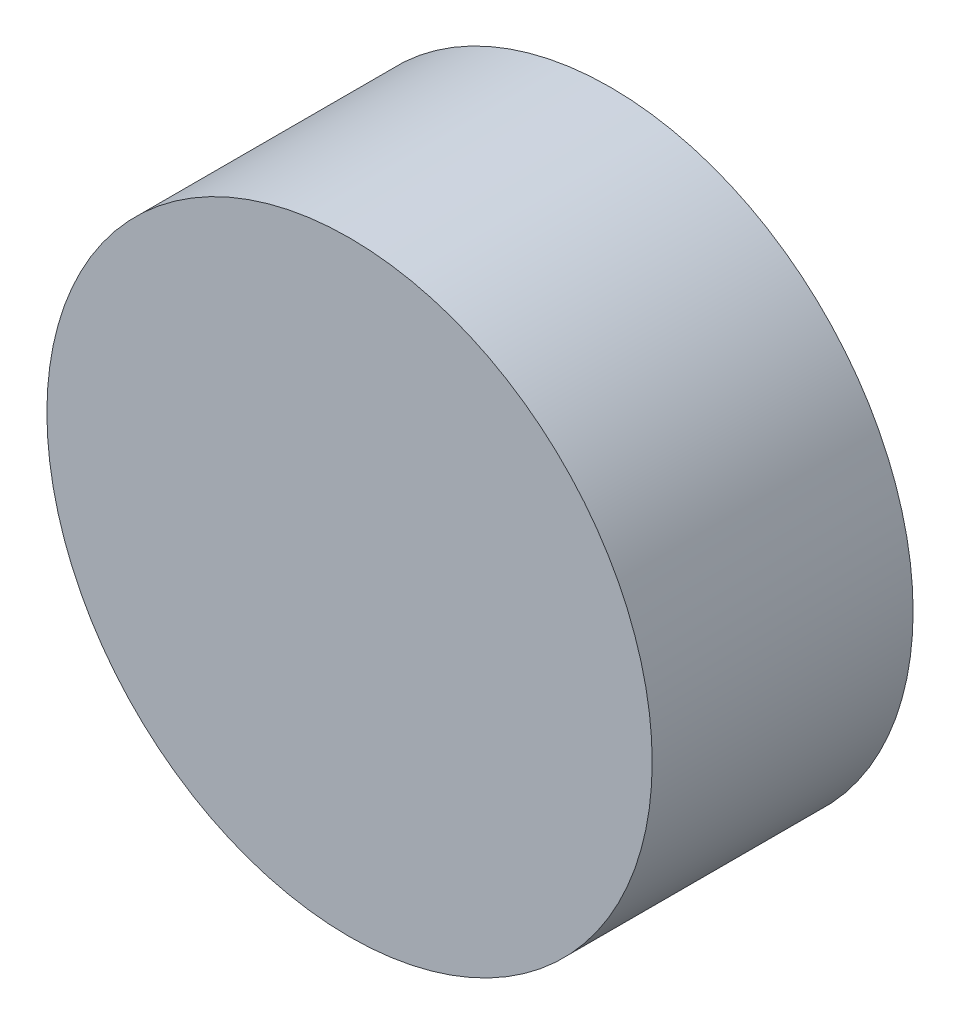
ISO-10303-21;
HEADER;
FILE_DESCRIPTION(('STEP AP214'),'2;1');
FILE_NAME('part.step','',(''),(''),'','','');
FILE_SCHEMA(('AUTOMOTIVE_DESIGN { 1 0 10303 214 1 1 1 1 }'));
ENDSEC;
DATA;
#1=APPLICATION_CONTEXT('core data for automotive mechanical design processes');
#2=APPLICATION_PROTOCOL_DEFINITION('international standard','automotive_design',2000,#1);
#3=PRODUCT_CONTEXT('',#1,'mechanical');
#4=PRODUCT('Part','Part','',(#3));
#5=PRODUCT_RELATED_PRODUCT_CATEGORY('part','',(#4));
#6=PRODUCT_DEFINITION_FORMATION('','',#4);
#7=PRODUCT_DEFINITION_CONTEXT('part definition',#1,'design');
#8=PRODUCT_DEFINITION('design','',#6,#7);
#9=PRODUCT_DEFINITION_SHAPE('','',#8);
#10=(LENGTH_UNIT() NAMED_UNIT(*) SI_UNIT(.MILLI.,.METRE.));
#11=(NAMED_UNIT(*) PLANE_ANGLE_UNIT() SI_UNIT($,.RADIAN.));
#12=(NAMED_UNIT(*) SI_UNIT($,.STERADIAN.) SOLID_ANGLE_UNIT());
#13=UNCERTAINTY_MEASURE_WITH_UNIT(LENGTH_MEASURE(1.E-05),#10,'distance_accuracy_value','');
#14=(GEOMETRIC_REPRESENTATION_CONTEXT(3) GLOBAL_UNCERTAINTY_ASSIGNED_CONTEXT((#13)) GLOBAL_UNIT_ASSIGNED_CONTEXT((#10,
#11,#12)) REPRESENTATION_CONTEXT('',''));
#15=CARTESIAN_POINT('',(0.,0.,0.));
#16=DIRECTION('',(0.,0.,1.));
#17=DIRECTION('',(1.,0.,0.));
#18=AXIS2_PLACEMENT_3D('',#15,#16,#17);
#19=CARTESIAN_POINT('',(0.,0.,25.));
#20=DIRECTION('',(0.,0.,-1.));
#21=DIRECTION('',(-1.,0.,0.));
#22=AXIS2_PLACEMENT_3D('',#19,#20,#21);
#23=CYLINDRICAL_SURFACE('',#22,29.);
#24=CARTESIAN_POINT('',(0.,0.,25.));
#25=DIRECTION('',(0.,0.,1.));
#26=DIRECTION('',(1.,0.,0.));
#27=AXIS2_PLACEMENT_3D('',#24,#25,#26);
#28=CIRCLE('',#27,29.);
#29=CARTESIAN_POINT('',(29.,0.,25.));
#30=VERTEX_POINT('',#29);
#31=EDGE_CURVE('E10',#30,#30,#28,.T.);
#32=ORIENTED_EDGE('',*,*,#31,.F.);
#33=EDGE_LOOP('',(#32));
#34=FACE_BOUND('',#33,.T.);
#35=CARTESIAN_POINT('',(0.,0.,0.));
#36=DIRECTION('',(0.,0.,1.));
#37=DIRECTION('',(1.,0.,0.));
#38=AXIS2_PLACEMENT_3D('',#35,#36,#37);
#39=CIRCLE('',#38,29.);
#40=CARTESIAN_POINT('',(29.,0.,0.));
#41=VERTEX_POINT('',#40);
#42=EDGE_CURVE('E38',#41,#41,#39,.T.);
#43=ORIENTED_EDGE('',*,*,#42,.T.);
#44=EDGE_LOOP('',(#43));
#45=FACE_BOUND('',#44,.T.);
#46=ADVANCED_FACE('F35',(#34,#45),#23,.T.);
#47=CARTESIAN_POINT('',(0.,0.,25.));
#48=DIRECTION('',(0.,0.,1.));
#49=DIRECTION('',(1.,0.,0.));
#50=AXIS2_PLACEMENT_3D('',#47,#48,#49);
#51=PLANE('',#50);
#52=ORIENTED_EDGE('',*,*,#31,.T.);
#53=EDGE_LOOP('',(#52));
#54=FACE_BOUND('',#53,.T.);
#55=ADVANCED_FACE('F50',(#54),#51,.T.);
#56=CARTESIAN_POINT('',(0.,0.,0.));
#57=DIRECTION('',(0.,0.,1.));
#58=DIRECTION('',(1.,0.,0.));
#59=AXIS2_PLACEMENT_3D('',#56,#57,#58);
#60=PLANE('',#59);
#61=ORIENTED_EDGE('',*,*,#42,.F.);
#62=EDGE_LOOP('',(#61));
#63=FACE_BOUND('',#62,.T.);
#64=ADVANCED_FACE('F48',(#63),#60,.F.);
#65=CLOSED_SHELL('',(#46,#55,#64));
#66=MANIFOLD_SOLID_BREP('B2',#65);
#67=ADVANCED_BREP_SHAPE_REPRESENTATION('',(#18,#66),#14);
#68=SHAPE_DEFINITION_REPRESENTATION(#9,#67);
ENDSEC;
END-ISO-10303-21;
